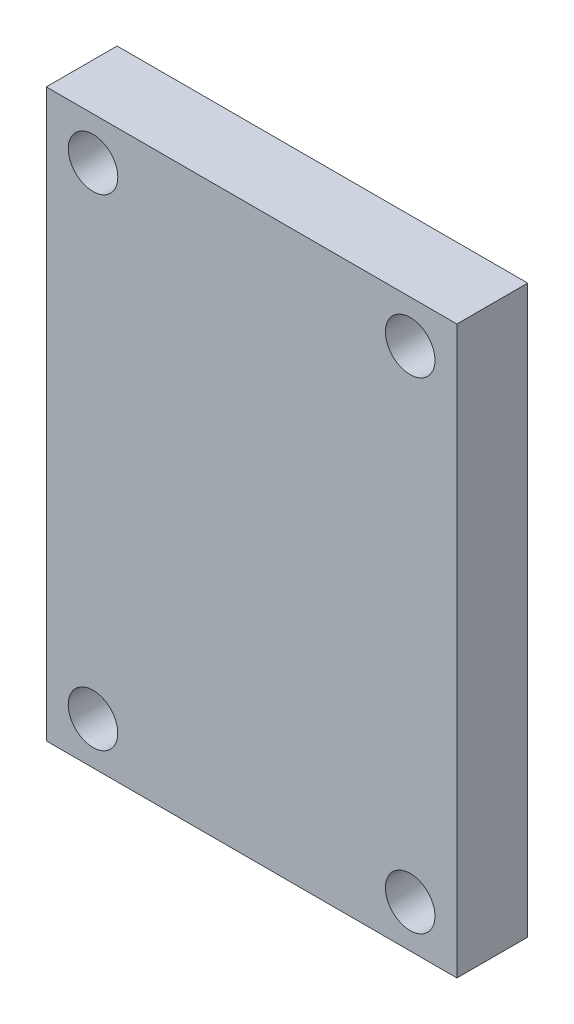
ISO-10303-21;
HEADER;
FILE_DESCRIPTION(('STEP AP214'),'2;1');
FILE_NAME('part.step','',(''),(''),'','','');
FILE_SCHEMA(('AUTOMOTIVE_DESIGN { 1 0 10303 214 1 1 1 1 }'));
ENDSEC;
DATA;
#1=APPLICATION_CONTEXT('core data for automotive mechanical design processes');
#2=APPLICATION_PROTOCOL_DEFINITION('international standard','automotive_design',2000,#1);
#3=PRODUCT_CONTEXT('',#1,'mechanical');
#4=PRODUCT('Part','Part','',(#3));
#5=PRODUCT_RELATED_PRODUCT_CATEGORY('part','',(#4));
#6=PRODUCT_DEFINITION_FORMATION('','',#4);
#7=PRODUCT_DEFINITION_CONTEXT('part definition',#1,'design');
#8=PRODUCT_DEFINITION('design','',#6,#7);
#9=PRODUCT_DEFINITION_SHAPE('','',#8);
#10=(LENGTH_UNIT() NAMED_UNIT(*) SI_UNIT(.MILLI.,.METRE.));
#11=(NAMED_UNIT(*) PLANE_ANGLE_UNIT() SI_UNIT($,.RADIAN.));
#12=(NAMED_UNIT(*) SI_UNIT($,.STERADIAN.) SOLID_ANGLE_UNIT());
#13=UNCERTAINTY_MEASURE_WITH_UNIT(LENGTH_MEASURE(1.E-05),#10,'distance_accuracy_value','');
#14=(GEOMETRIC_REPRESENTATION_CONTEXT(3) GLOBAL_UNCERTAINTY_ASSIGNED_CONTEXT((#13)) GLOBAL_UNIT_ASSIGNED_CONTEXT((#10,
#11,#12)) REPRESENTATION_CONTEXT('',''));
#15=CARTESIAN_POINT('',(0.,0.,0.));
#16=DIRECTION('',(0.,0.,1.));
#17=DIRECTION('',(1.,0.,0.));
#18=AXIS2_PLACEMENT_3D('',#15,#16,#17);
#19=CARTESIAN_POINT('',(0.,0.,5.));
#20=DIRECTION('',(0.,0.,1.));
#21=DIRECTION('',(1.,0.,0.));
#22=AXIS2_PLACEMENT_3D('',#19,#20,#21);
#23=PLANE('',#22);
#24=CARTESIAN_POINT('',(11.1994237541486,-17.,5.));
#25=DIRECTION('',(0.,0.,1.));
#26=DIRECTION('',(-1.,0.,0.));
#27=AXIS2_PLACEMENT_3D('',#24,#25,#26);
#28=CIRCLE('',#27,1.75);
#29=CARTESIAN_POINT('',(9.44942375414862,-17.,5.));
#30=VERTEX_POINT('',#29);
#31=EDGE_CURVE('E121',#30,#30,#28,.T.);
#32=ORIENTED_EDGE('',*,*,#31,.F.);
#33=EDGE_LOOP('',(#32));
#34=FACE_BOUND('',#33,.T.);
#35=CARTESIAN_POINT('',(11.1994237541486,17.,5.));
#36=DIRECTION('',(0.,0.,1.));
#37=DIRECTION('',(1.,0.,0.));
#38=AXIS2_PLACEMENT_3D('',#35,#36,#37);
#39=CIRCLE('',#38,1.75);
#40=CARTESIAN_POINT('',(12.9494237541486,17.,5.));
#41=VERTEX_POINT('',#40);
#42=EDGE_CURVE('E100',#41,#41,#39,.T.);
#43=ORIENTED_EDGE('',*,*,#42,.F.);
#44=EDGE_LOOP('',(#43));
#45=FACE_BOUND('',#44,.T.);
#46=DIRECTION('',(0.,-1.,0.));
#47=VECTOR('',#46,1.);
#48=CARTESIAN_POINT('',(-14.5,-20.,5.));
#49=LINE('',#48,#47);
#50=CARTESIAN_POINT('',(-14.5,20.,5.));
#51=VERTEX_POINT('',#50);
#52=CARTESIAN_POINT('',(-14.5,-20.,5.));
#53=VERTEX_POINT('',#52);
#54=EDGE_CURVE('E85',#51,#53,#49,.T.);
#55=ORIENTED_EDGE('',*,*,#54,.T.);
#56=DIRECTION('',(1.,0.,0.));
#57=VECTOR('',#56,1.);
#58=CARTESIAN_POINT('',(14.5,-20.,5.));
#59=LINE('',#58,#57);
#60=CARTESIAN_POINT('',(14.5,-20.,5.));
#61=VERTEX_POINT('',#60);
#62=EDGE_CURVE('E80',#53,#61,#59,.T.);
#63=ORIENTED_EDGE('',*,*,#62,.T.);
#64=DIRECTION('',(0.,1.,0.));
#65=VECTOR('',#64,1.);
#66=CARTESIAN_POINT('',(14.5,-20.,5.));
#67=LINE('',#66,#65);
#68=CARTESIAN_POINT('',(14.5,20.,5.));
#69=VERTEX_POINT('',#68);
#70=EDGE_CURVE('E83',#61,#69,#67,.T.);
#71=ORIENTED_EDGE('',*,*,#70,.T.);
#72=DIRECTION('',(-1.,0.,0.));
#73=VECTOR('',#72,1.);
#74=CARTESIAN_POINT('',(14.5,20.,5.));
#75=LINE('',#74,#73);
#76=EDGE_CURVE('E50',#69,#51,#75,.T.);
#77=ORIENTED_EDGE('',*,*,#76,.T.);
#78=EDGE_LOOP('',(#55,#63,#71,#77));
#79=FACE_BOUND('',#78,.T.);
#80=CARTESIAN_POINT('',(-11.1994237541486,17.,5.));
#81=DIRECTION('',(0.,0.,1.));
#82=DIRECTION('',(1.,0.,0.));
#83=AXIS2_PLACEMENT_3D('',#80,#81,#82);
#84=CIRCLE('',#83,1.75);
#85=CARTESIAN_POINT('',(-9.4494237541486,17.,5.));
#86=VERTEX_POINT('',#85);
#87=EDGE_CURVE('E115',#86,#86,#84,.T.);
#88=ORIENTED_EDGE('',*,*,#87,.F.);
#89=EDGE_LOOP('',(#88));
#90=FACE_BOUND('',#89,.T.);
#91=CARTESIAN_POINT('',(-11.1994237541486,-17.,5.));
#92=DIRECTION('',(0.,0.,1.));
#93=DIRECTION('',(-1.,0.,0.));
#94=AXIS2_PLACEMENT_3D('',#91,#92,#93);
#95=CIRCLE('',#94,1.75);
#96=CARTESIAN_POINT('',(-12.9494237541486,-17.,5.));
#97=VERTEX_POINT('',#96);
#98=EDGE_CURVE('E127',#97,#97,#95,.T.);
#99=ORIENTED_EDGE('',*,*,#98,.F.);
#100=EDGE_LOOP('',(#99));
#101=FACE_BOUND('',#100,.T.);
#102=ADVANCED_FACE('F33',(#34,#45,#79,#90,#101),#23,.T.);
#103=CARTESIAN_POINT('',(0.,0.,0.));
#104=DIRECTION('',(0.,0.,1.));
#105=DIRECTION('',(1.,0.,0.));
#106=AXIS2_PLACEMENT_3D('',#103,#104,#105);
#107=PLANE('',#106);
#108=DIRECTION('',(0.,-1.,0.));
#109=VECTOR('',#108,1.);
#110=CARTESIAN_POINT('',(-14.5,-20.,0.));
#111=LINE('',#110,#109);
#112=CARTESIAN_POINT('',(-14.5,20.,0.));
#113=VERTEX_POINT('',#112);
#114=CARTESIAN_POINT('',(-14.5,-20.,0.));
#115=VERTEX_POINT('',#114);
#116=EDGE_CURVE('E97',#113,#115,#111,.T.);
#117=ORIENTED_EDGE('',*,*,#116,.F.);
#118=DIRECTION('',(-1.,0.,0.));
#119=VECTOR('',#118,1.);
#120=CARTESIAN_POINT('',(14.5,20.,0.));
#121=LINE('',#120,#119);
#122=CARTESIAN_POINT('',(14.5,20.,0.));
#123=VERTEX_POINT('',#122);
#124=EDGE_CURVE('E73',#123,#113,#121,.T.);
#125=ORIENTED_EDGE('',*,*,#124,.F.);
#126=DIRECTION('',(0.,1.,0.));
#127=VECTOR('',#126,1.);
#128=CARTESIAN_POINT('',(14.5,-20.,0.));
#129=LINE('',#128,#127);
#130=CARTESIAN_POINT('',(14.5,-20.,0.));
#131=VERTEX_POINT('',#130);
#132=EDGE_CURVE('E67',#131,#123,#129,.T.);
#133=ORIENTED_EDGE('',*,*,#132,.F.);
#134=DIRECTION('',(1.,0.,0.));
#135=VECTOR('',#134,1.);
#136=CARTESIAN_POINT('',(14.5,-20.,0.));
#137=LINE('',#136,#135);
#138=EDGE_CURVE('E89',#115,#131,#137,.T.);
#139=ORIENTED_EDGE('',*,*,#138,.F.);
#140=EDGE_LOOP('',(#117,#125,#133,#139));
#141=FACE_BOUND('',#140,.T.);
#142=CARTESIAN_POINT('',(11.1994237541486,17.,0.));
#143=DIRECTION('',(0.,0.,1.));
#144=DIRECTION('',(1.,0.,0.));
#145=AXIS2_PLACEMENT_3D('',#142,#143,#144);
#146=CIRCLE('',#145,1.75);
#147=CARTESIAN_POINT('',(12.9494237541486,17.,0.));
#148=VERTEX_POINT('',#147);
#149=EDGE_CURVE('E112',#148,#148,#146,.T.);
#150=ORIENTED_EDGE('',*,*,#149,.T.);
#151=EDGE_LOOP('',(#150));
#152=FACE_BOUND('',#151,.T.);
#153=CARTESIAN_POINT('',(-11.1994237541486,17.,0.));
#154=DIRECTION('',(0.,0.,1.));
#155=DIRECTION('',(1.,0.,0.));
#156=AXIS2_PLACEMENT_3D('',#153,#154,#155);
#157=CIRCLE('',#156,1.75);
#158=CARTESIAN_POINT('',(-9.4494237541486,17.,0.));
#159=VERTEX_POINT('',#158);
#160=EDGE_CURVE('E118',#159,#159,#157,.T.);
#161=ORIENTED_EDGE('',*,*,#160,.T.);
#162=EDGE_LOOP('',(#161));
#163=FACE_BOUND('',#162,.T.);
#164=CARTESIAN_POINT('',(11.1994237541486,-17.,0.));
#165=DIRECTION('',(0.,0.,1.));
#166=DIRECTION('',(-1.,0.,0.));
#167=AXIS2_PLACEMENT_3D('',#164,#165,#166);
#168=CIRCLE('',#167,1.75);
#169=CARTESIAN_POINT('',(9.44942375414862,-17.,0.));
#170=VERTEX_POINT('',#169);
#171=EDGE_CURVE('E124',#170,#170,#168,.T.);
#172=ORIENTED_EDGE('',*,*,#171,.T.);
#173=EDGE_LOOP('',(#172));
#174=FACE_BOUND('',#173,.T.);
#175=CARTESIAN_POINT('',(-11.1994237541486,-17.,0.));
#176=DIRECTION('',(0.,0.,1.));
#177=DIRECTION('',(-1.,0.,0.));
#178=AXIS2_PLACEMENT_3D('',#175,#176,#177);
#179=CIRCLE('',#178,1.75);
#180=CARTESIAN_POINT('',(-12.9494237541486,-17.,0.));
#181=VERTEX_POINT('',#180);
#182=EDGE_CURVE('E130',#181,#181,#179,.T.);
#183=ORIENTED_EDGE('',*,*,#182,.T.);
#184=EDGE_LOOP('',(#183));
#185=FACE_BOUND('',#184,.T.);
#186=ADVANCED_FACE('F108',(#141,#152,#163,#174,#185),#107,.F.);
#187=CARTESIAN_POINT('',(-14.5,-20.,5.));
#188=DIRECTION('',(1.,0.,0.));
#189=DIRECTION('',(0.,0.,-1.));
#190=AXIS2_PLACEMENT_3D('',#187,#188,#189);
#191=PLANE('',#190);
#192=ORIENTED_EDGE('',*,*,#116,.T.);
#193=DIRECTION('',(0.,0.,-1.));
#194=VECTOR('',#193,1.);
#195=CARTESIAN_POINT('',(-14.5,-20.,5.));
#196=LINE('',#195,#194);
#197=EDGE_CURVE('E11',#53,#115,#196,.T.);
#198=ORIENTED_EDGE('',*,*,#197,.F.);
#199=ORIENTED_EDGE('',*,*,#54,.F.);
#200=DIRECTION('',(0.,0.,-1.));
#201=VECTOR('',#200,1.);
#202=CARTESIAN_POINT('',(-14.5,20.,5.));
#203=LINE('',#202,#201);
#204=EDGE_CURVE('E93',#51,#113,#203,.T.);
#205=ORIENTED_EDGE('',*,*,#204,.T.);
#206=EDGE_LOOP('',(#192,#198,#199,#205));
#207=FACE_BOUND('',#206,.T.);
#208=ADVANCED_FACE('F35',(#207),#191,.F.);
#209=CARTESIAN_POINT('',(14.5,-20.,5.));
#210=DIRECTION('',(0.,1.,0.));
#211=DIRECTION('',(0.,0.,1.));
#212=AXIS2_PLACEMENT_3D('',#209,#210,#211);
#213=PLANE('',#212);
#214=ORIENTED_EDGE('',*,*,#138,.T.);
#215=DIRECTION('',(0.,0.,-1.));
#216=VECTOR('',#215,1.);
#217=CARTESIAN_POINT('',(14.5,-20.,5.));
#218=LINE('',#217,#216);
#219=EDGE_CURVE('E42',#61,#131,#218,.T.);
#220=ORIENTED_EDGE('',*,*,#219,.F.);
#221=ORIENTED_EDGE('',*,*,#62,.F.);
#222=ORIENTED_EDGE('',*,*,#197,.T.);
#223=EDGE_LOOP('',(#214,#220,#221,#222));
#224=FACE_BOUND('',#223,.T.);
#225=ADVANCED_FACE('F88',(#224),#213,.F.);
#226=CARTESIAN_POINT('',(14.5,-20.,5.));
#227=DIRECTION('',(-1.,0.,0.));
#228=DIRECTION('',(0.,0.,1.));
#229=AXIS2_PLACEMENT_3D('',#226,#227,#228);
#230=PLANE('',#229);
#231=ORIENTED_EDGE('',*,*,#132,.T.);
#232=DIRECTION('',(0.,0.,-1.));
#233=VECTOR('',#232,1.);
#234=CARTESIAN_POINT('',(14.5,20.,5.));
#235=LINE('',#234,#233);
#236=EDGE_CURVE('E90',#69,#123,#235,.T.);
#237=ORIENTED_EDGE('',*,*,#236,.F.);
#238=ORIENTED_EDGE('',*,*,#70,.F.);
#239=ORIENTED_EDGE('',*,*,#219,.T.);
#240=EDGE_LOOP('',(#231,#237,#238,#239));
#241=FACE_BOUND('',#240,.T.);
#242=ADVANCED_FACE('F91',(#241),#230,.F.);
#243=CARTESIAN_POINT('',(14.5,20.,5.));
#244=DIRECTION('',(0.,-1.,0.));
#245=DIRECTION('',(0.,0.,-1.));
#246=AXIS2_PLACEMENT_3D('',#243,#244,#245);
#247=PLANE('',#246);
#248=ORIENTED_EDGE('',*,*,#124,.T.);
#249=ORIENTED_EDGE('',*,*,#204,.F.);
#250=ORIENTED_EDGE('',*,*,#76,.F.);
#251=ORIENTED_EDGE('',*,*,#236,.T.);
#252=EDGE_LOOP('',(#248,#249,#250,#251));
#253=FACE_BOUND('',#252,.T.);
#254=ADVANCED_FACE('F105',(#253),#247,.F.);
#255=CARTESIAN_POINT('',(11.1994237541486,17.,5.));
#256=DIRECTION('',(0.,0.,-1.));
#257=DIRECTION('',(-1.,0.,0.));
#258=AXIS2_PLACEMENT_3D('',#255,#256,#257);
#259=CYLINDRICAL_SURFACE('',#258,1.75);
#260=ORIENTED_EDGE('',*,*,#42,.T.);
#261=EDGE_LOOP('',(#260));
#262=FACE_BOUND('',#261,.T.);
#263=ORIENTED_EDGE('',*,*,#149,.F.);
#264=EDGE_LOOP('',(#263));
#265=FACE_BOUND('',#264,.T.);
#266=ADVANCED_FACE('F149',(#262,#265),#259,.F.);
#267=CARTESIAN_POINT('',(-11.1994237541486,17.,5.));
#268=DIRECTION('',(0.,0.,-1.));
#269=DIRECTION('',(-1.,0.,0.));
#270=AXIS2_PLACEMENT_3D('',#267,#268,#269);
#271=CYLINDRICAL_SURFACE('',#270,1.75);
#272=ORIENTED_EDGE('',*,*,#87,.T.);
#273=EDGE_LOOP('',(#272));
#274=FACE_BOUND('',#273,.T.);
#275=ORIENTED_EDGE('',*,*,#160,.F.);
#276=EDGE_LOOP('',(#275));
#277=FACE_BOUND('',#276,.T.);
#278=ADVANCED_FACE('F195',(#274,#277),#271,.F.);
#279=CARTESIAN_POINT('',(11.1994237541486,-17.,5.));
#280=DIRECTION('',(0.,0.,-1.));
#281=DIRECTION('',(-1.,0.,0.));
#282=AXIS2_PLACEMENT_3D('',#279,#280,#281);
#283=CYLINDRICAL_SURFACE('',#282,1.75);
#284=ORIENTED_EDGE('',*,*,#31,.T.);
#285=EDGE_LOOP('',(#284));
#286=FACE_BOUND('',#285,.T.);
#287=ORIENTED_EDGE('',*,*,#171,.F.);
#288=EDGE_LOOP('',(#287));
#289=FACE_BOUND('',#288,.T.);
#290=ADVANCED_FACE('F203',(#286,#289),#283,.F.);
#291=CARTESIAN_POINT('',(-11.1994237541486,-17.,5.));
#292=DIRECTION('',(0.,0.,-1.));
#293=DIRECTION('',(-1.,0.,0.));
#294=AXIS2_PLACEMENT_3D('',#291,#292,#293);
#295=CYLINDRICAL_SURFACE('',#294,1.75);
#296=ORIENTED_EDGE('',*,*,#98,.T.);
#297=EDGE_LOOP('',(#296));
#298=FACE_BOUND('',#297,.T.);
#299=ORIENTED_EDGE('',*,*,#182,.F.);
#300=EDGE_LOOP('',(#299));
#301=FACE_BOUND('',#300,.T.);
#302=ADVANCED_FACE('F136',(#298,#301),#295,.F.);
#303=CLOSED_SHELL('',(#102,#186,#208,#225,#242,#254,#266,#278,#290,#302));
#304=MANIFOLD_SOLID_BREP('B2',#303);
#305=ADVANCED_BREP_SHAPE_REPRESENTATION('',(#18,#304),#14);
#306=SHAPE_DEFINITION_REPRESENTATION(#9,#305);
ENDSEC;
END-ISO-10303-21;
